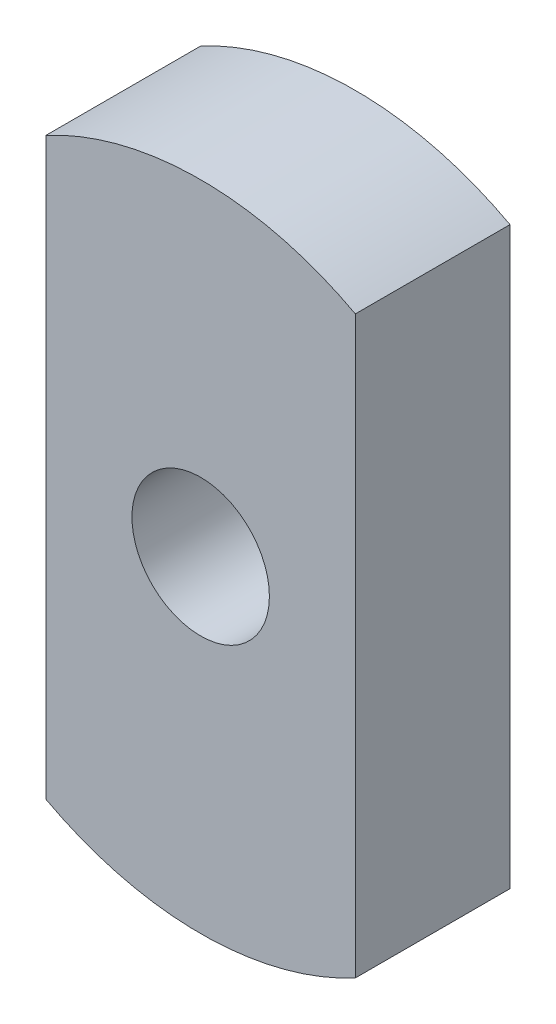
ISO-10303-21;
HEADER;
FILE_DESCRIPTION(('STEP AP214'),'2;1');
FILE_NAME('part.step','',(''),(''),'','','');
FILE_SCHEMA(('AUTOMOTIVE_DESIGN { 1 0 10303 214 1 1 1 1 }'));
ENDSEC;
DATA;
#1=APPLICATION_CONTEXT('core data for automotive mechanical design processes');
#2=APPLICATION_PROTOCOL_DEFINITION('international standard','automotive_design',2000,#1);
#3=PRODUCT_CONTEXT('',#1,'mechanical');
#4=PRODUCT('Part','Part','',(#3));
#5=PRODUCT_RELATED_PRODUCT_CATEGORY('part','',(#4));
#6=PRODUCT_DEFINITION_FORMATION('','',#4);
#7=PRODUCT_DEFINITION_CONTEXT('part definition',#1,'design');
#8=PRODUCT_DEFINITION('design','',#6,#7);
#9=PRODUCT_DEFINITION_SHAPE('','',#8);
#10=(LENGTH_UNIT() NAMED_UNIT(*) SI_UNIT(.MILLI.,.METRE.));
#11=(NAMED_UNIT(*) PLANE_ANGLE_UNIT() SI_UNIT($,.RADIAN.));
#12=(NAMED_UNIT(*) SI_UNIT($,.STERADIAN.) SOLID_ANGLE_UNIT());
#13=UNCERTAINTY_MEASURE_WITH_UNIT(LENGTH_MEASURE(1.E-05),#10,'distance_accuracy_value','');
#14=(GEOMETRIC_REPRESENTATION_CONTEXT(3) GLOBAL_UNCERTAINTY_ASSIGNED_CONTEXT((#13)) GLOBAL_UNIT_ASSIGNED_CONTEXT((#10,
#11,#12)) REPRESENTATION_CONTEXT('',''));
#15=CARTESIAN_POINT('',(0.,0.,0.));
#16=DIRECTION('',(0.,0.,1.));
#17=DIRECTION('',(1.,0.,0.));
#18=AXIS2_PLACEMENT_3D('',#15,#16,#17);
#19=CARTESIAN_POINT('',(0.,0.,4.5));
#20=DIRECTION('',(0.,0.,-1.));
#21=DIRECTION('',(-1.,0.,0.));
#22=AXIS2_PLACEMENT_3D('',#19,#20,#21);
#23=PLANE('',#22);
#24=CARTESIAN_POINT('',(0.,0.,4.5));
#25=DIRECTION('',(0.,0.,1.));
#26=DIRECTION('',(-1.,0.,0.));
#27=AXIS2_PLACEMENT_3D('',#24,#25,#26);
#28=CIRCLE('',#27,9.5);
#29=CARTESIAN_POINT('',(4.5,8.36660026534075,4.5));
#30=VERTEX_POINT('',#29);
#31=CARTESIAN_POINT('',(-4.5,8.36660026534075,4.5));
#32=VERTEX_POINT('',#31);
#33=EDGE_CURVE('E85',#30,#32,#28,.T.);
#34=ORIENTED_EDGE('',*,*,#33,.T.);
#35=DIRECTION('',(0.,-1.,0.));
#36=VECTOR('',#35,1.);
#37=CARTESIAN_POINT('',(-4.5,8.36660026534075,4.5));
#38=LINE('',#37,#36);
#39=CARTESIAN_POINT('',(-4.5,-8.36660026534075,4.5));
#40=VERTEX_POINT('',#39);
#41=EDGE_CURVE('E80',#32,#40,#38,.T.);
#42=ORIENTED_EDGE('',*,*,#41,.T.);
#43=CARTESIAN_POINT('',(0.,0.,4.5));
#44=DIRECTION('',(0.,0.,1.));
#45=DIRECTION('',(1.,0.,0.));
#46=AXIS2_PLACEMENT_3D('',#43,#44,#45);
#47=CIRCLE('',#46,9.50000000000001);
#48=CARTESIAN_POINT('',(4.49999999999999,-8.36660026534076,4.5));
#49=VERTEX_POINT('',#48);
#50=EDGE_CURVE('E83',#40,#49,#47,.T.);
#51=ORIENTED_EDGE('',*,*,#50,.T.);
#52=DIRECTION('',(0.,1.,0.));
#53=VECTOR('',#52,1.);
#54=CARTESIAN_POINT('',(4.5,8.36660026534075,4.5));
#55=LINE('',#54,#53);
#56=EDGE_CURVE('E50',#49,#30,#55,.T.);
#57=ORIENTED_EDGE('',*,*,#56,.T.);
#58=EDGE_LOOP('',(#34,#42,#51,#57));
#59=FACE_BOUND('',#58,.T.);
#60=CARTESIAN_POINT('',(0.,0.,4.5));
#61=DIRECTION('',(0.,0.,1.));
#62=DIRECTION('',(1.,0.,0.));
#63=AXIS2_PLACEMENT_3D('',#60,#61,#62);
#64=CIRCLE('',#63,2.);
#65=CARTESIAN_POINT('',(2.,0.,4.5));
#66=VERTEX_POINT('',#65);
#67=EDGE_CURVE('E100',#66,#66,#64,.T.);
#68=ORIENTED_EDGE('',*,*,#67,.F.);
#69=EDGE_LOOP('',(#68));
#70=FACE_BOUND('',#69,.T.);
#71=ADVANCED_FACE('F33',(#59,#70),#23,.F.);
#72=CARTESIAN_POINT('',(0.,0.,0.));
#73=DIRECTION('',(0.,0.,-1.));
#74=DIRECTION('',(-1.,0.,0.));
#75=AXIS2_PLACEMENT_3D('',#72,#73,#74);
#76=PLANE('',#75);
#77=CARTESIAN_POINT('',(0.,0.,0.));
#78=DIRECTION('',(0.,0.,1.));
#79=DIRECTION('',(-1.,0.,0.));
#80=AXIS2_PLACEMENT_3D('',#77,#78,#79);
#81=CIRCLE('',#80,9.5);
#82=CARTESIAN_POINT('',(4.5,8.36660026534075,0.));
#83=VERTEX_POINT('',#82);
#84=CARTESIAN_POINT('',(-4.5,8.36660026534075,0.));
#85=VERTEX_POINT('',#84);
#86=EDGE_CURVE('E97',#83,#85,#81,.T.);
#87=ORIENTED_EDGE('',*,*,#86,.F.);
#88=DIRECTION('',(0.,1.,0.));
#89=VECTOR('',#88,1.);
#90=CARTESIAN_POINT('',(4.5,8.36660026534075,0.));
#91=LINE('',#90,#89);
#92=CARTESIAN_POINT('',(4.49999999999999,-8.36660026534076,0.));
#93=VERTEX_POINT('',#92);
#94=EDGE_CURVE('E73',#93,#83,#91,.T.);
#95=ORIENTED_EDGE('',*,*,#94,.F.);
#96=CARTESIAN_POINT('',(0.,0.,0.));
#97=DIRECTION('',(0.,0.,1.));
#98=DIRECTION('',(1.,0.,0.));
#99=AXIS2_PLACEMENT_3D('',#96,#97,#98);
#100=CIRCLE('',#99,9.50000000000001);
#101=CARTESIAN_POINT('',(-4.5,-8.36660026534075,0.));
#102=VERTEX_POINT('',#101);
#103=EDGE_CURVE('E67',#102,#93,#100,.T.);
#104=ORIENTED_EDGE('',*,*,#103,.F.);
#105=DIRECTION('',(0.,-1.,0.));
#106=VECTOR('',#105,1.);
#107=CARTESIAN_POINT('',(-4.5,8.36660026534075,0.));
#108=LINE('',#107,#106);
#109=EDGE_CURVE('E89',#85,#102,#108,.T.);
#110=ORIENTED_EDGE('',*,*,#109,.F.);
#111=EDGE_LOOP('',(#87,#95,#104,#110));
#112=FACE_BOUND('',#111,.T.);
#113=CARTESIAN_POINT('',(0.,0.,0.));
#114=DIRECTION('',(0.,0.,1.));
#115=DIRECTION('',(1.,0.,0.));
#116=AXIS2_PLACEMENT_3D('',#113,#114,#115);
#117=CIRCLE('',#116,2.);
#118=CARTESIAN_POINT('',(2.,0.,0.));
#119=VERTEX_POINT('',#118);
#120=EDGE_CURVE('E112',#119,#119,#117,.T.);
#121=ORIENTED_EDGE('',*,*,#120,.T.);
#122=EDGE_LOOP('',(#121));
#123=FACE_BOUND('',#122,.T.);
#124=ADVANCED_FACE('F108',(#112,#123),#76,.T.);
#125=CARTESIAN_POINT('',(0.,0.,4.5));
#126=DIRECTION('',(0.,0.,-1.));
#127=DIRECTION('',(-1.,0.,0.));
#128=AXIS2_PLACEMENT_3D('',#125,#126,#127);
#129=CYLINDRICAL_SURFACE('',#128,9.5);
#130=ORIENTED_EDGE('',*,*,#86,.T.);
#131=DIRECTION('',(0.,0.,-1.));
#132=VECTOR('',#131,1.);
#133=CARTESIAN_POINT('',(-4.5,8.36660026534075,4.5));
#134=LINE('',#133,#132);
#135=EDGE_CURVE('E11',#32,#85,#134,.T.);
#136=ORIENTED_EDGE('',*,*,#135,.F.);
#137=ORIENTED_EDGE('',*,*,#33,.F.);
#138=DIRECTION('',(0.,0.,-1.));
#139=VECTOR('',#138,1.);
#140=CARTESIAN_POINT('',(4.5,8.36660026534075,4.5));
#141=LINE('',#140,#139);
#142=EDGE_CURVE('E93',#30,#83,#141,.T.);
#143=ORIENTED_EDGE('',*,*,#142,.T.);
#144=EDGE_LOOP('',(#130,#136,#137,#143));
#145=FACE_BOUND('',#144,.T.);
#146=ADVANCED_FACE('F35',(#145),#129,.T.);
#147=CARTESIAN_POINT('',(-4.5,8.36660026534075,4.5));
#148=DIRECTION('',(1.,0.,0.));
#149=DIRECTION('',(0.,0.,-1.));
#150=AXIS2_PLACEMENT_3D('',#147,#148,#149);
#151=PLANE('',#150);
#152=ORIENTED_EDGE('',*,*,#109,.T.);
#153=DIRECTION('',(0.,0.,-1.));
#154=VECTOR('',#153,1.);
#155=CARTESIAN_POINT('',(-4.5,-8.36660026534075,4.5));
#156=LINE('',#155,#154);
#157=EDGE_CURVE('E42',#40,#102,#156,.T.);
#158=ORIENTED_EDGE('',*,*,#157,.F.);
#159=ORIENTED_EDGE('',*,*,#41,.F.);
#160=ORIENTED_EDGE('',*,*,#135,.T.);
#161=EDGE_LOOP('',(#152,#158,#159,#160));
#162=FACE_BOUND('',#161,.T.);
#163=ADVANCED_FACE('F88',(#162),#151,.F.);
#164=CARTESIAN_POINT('',(0.,0.,4.5));
#165=DIRECTION('',(0.,0.,-1.));
#166=DIRECTION('',(-1.,0.,0.));
#167=AXIS2_PLACEMENT_3D('',#164,#165,#166);
#168=CYLINDRICAL_SURFACE('',#167,9.50000000000001);
#169=ORIENTED_EDGE('',*,*,#103,.T.);
#170=DIRECTION('',(0.,0.,-1.));
#171=VECTOR('',#170,1.);
#172=CARTESIAN_POINT('',(4.49999999999999,-8.36660026534076,4.5));
#173=LINE('',#172,#171);
#174=EDGE_CURVE('E90',#49,#93,#173,.T.);
#175=ORIENTED_EDGE('',*,*,#174,.F.);
#176=ORIENTED_EDGE('',*,*,#50,.F.);
#177=ORIENTED_EDGE('',*,*,#157,.T.);
#178=EDGE_LOOP('',(#169,#175,#176,#177));
#179=FACE_BOUND('',#178,.T.);
#180=ADVANCED_FACE('F91',(#179),#168,.T.);
#181=CARTESIAN_POINT('',(4.5,8.36660026534075,4.5));
#182=DIRECTION('',(-1.,0.,0.));
#183=DIRECTION('',(0.,0.,1.));
#184=AXIS2_PLACEMENT_3D('',#181,#182,#183);
#185=PLANE('',#184);
#186=ORIENTED_EDGE('',*,*,#94,.T.);
#187=ORIENTED_EDGE('',*,*,#142,.F.);
#188=ORIENTED_EDGE('',*,*,#56,.F.);
#189=ORIENTED_EDGE('',*,*,#174,.T.);
#190=EDGE_LOOP('',(#186,#187,#188,#189));
#191=FACE_BOUND('',#190,.T.);
#192=ADVANCED_FACE('F105',(#191),#185,.F.);
#193=CARTESIAN_POINT('',(0.,0.,4.5));
#194=DIRECTION('',(0.,0.,-1.));
#195=DIRECTION('',(-1.,0.,0.));
#196=AXIS2_PLACEMENT_3D('',#193,#194,#195);
#197=CYLINDRICAL_SURFACE('',#196,2.);
#198=ORIENTED_EDGE('',*,*,#67,.T.);
#199=EDGE_LOOP('',(#198));
#200=FACE_BOUND('',#199,.T.);
#201=ORIENTED_EDGE('',*,*,#120,.F.);
#202=EDGE_LOOP('',(#201));
#203=FACE_BOUND('',#202,.T.);
#204=ADVANCED_FACE('F118',(#200,#203),#197,.F.);
#205=CLOSED_SHELL('',(#71,#124,#146,#163,#180,#192,#204));
#206=MANIFOLD_SOLID_BREP('B2',#205);
#207=ADVANCED_BREP_SHAPE_REPRESENTATION('',(#18,#206),#14);
#208=SHAPE_DEFINITION_REPRESENTATION(#9,#207);
ENDSEC;
END-ISO-10303-21;
